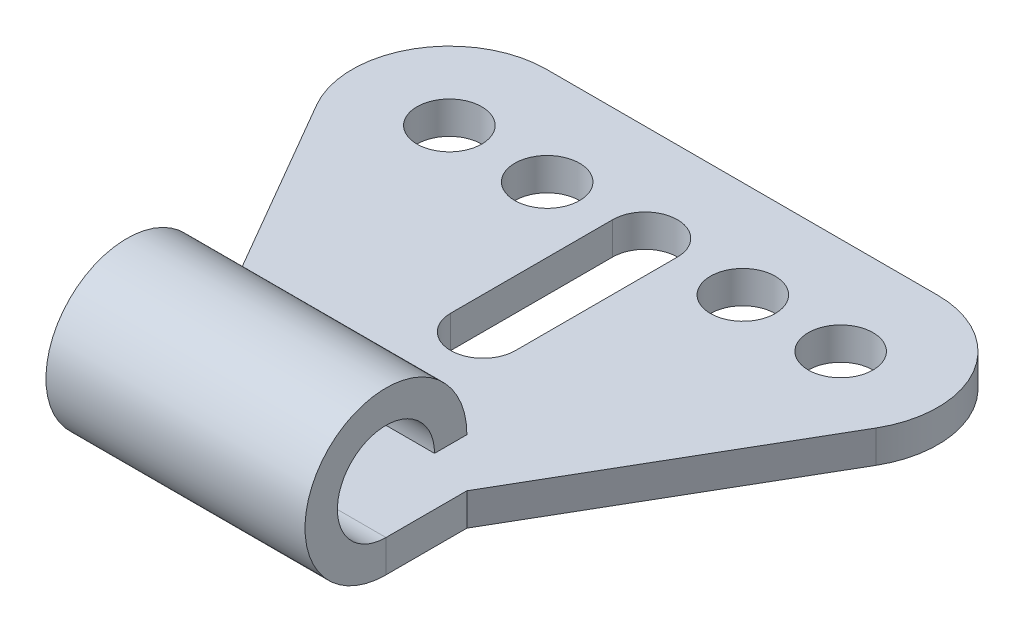
ISO-10303-21;
HEADER;
FILE_DESCRIPTION(('STEP AP214'),'2;1');
FILE_NAME('part.step','',(''),(''),'','','');
FILE_SCHEMA(('AUTOMOTIVE_DESIGN { 1 0 10303 214 1 1 1 1 }'));
ENDSEC;
DATA;
#1=APPLICATION_CONTEXT('core data for automotive mechanical design processes');
#2=APPLICATION_PROTOCOL_DEFINITION('international standard','automotive_design',2000,#1);
#3=PRODUCT_CONTEXT('',#1,'mechanical');
#4=PRODUCT('Part','Part','',(#3));
#5=PRODUCT_RELATED_PRODUCT_CATEGORY('part','',(#4));
#6=PRODUCT_DEFINITION_FORMATION('','',#4);
#7=PRODUCT_DEFINITION_CONTEXT('part definition',#1,'design');
#8=PRODUCT_DEFINITION('design','',#6,#7);
#9=PRODUCT_DEFINITION_SHAPE('','',#8);
#10=(LENGTH_UNIT() NAMED_UNIT(*) SI_UNIT(.MILLI.,.METRE.));
#11=(NAMED_UNIT(*) PLANE_ANGLE_UNIT() SI_UNIT($,.RADIAN.));
#12=(NAMED_UNIT(*) SI_UNIT($,.STERADIAN.) SOLID_ANGLE_UNIT());
#13=UNCERTAINTY_MEASURE_WITH_UNIT(LENGTH_MEASURE(1.E-05),#10,'distance_accuracy_value','');
#14=(GEOMETRIC_REPRESENTATION_CONTEXT(3) GLOBAL_UNCERTAINTY_ASSIGNED_CONTEXT((#13)) GLOBAL_UNIT_ASSIGNED_CONTEXT((#10,
#11,#12)) REPRESENTATION_CONTEXT('',''));
#15=CARTESIAN_POINT('',(0.,0.,0.));
#16=DIRECTION('',(0.,0.,1.));
#17=DIRECTION('',(1.,0.,0.));
#18=AXIS2_PLACEMENT_3D('',#15,#16,#17);
#19=CARTESIAN_POINT('',(-12.0838339120232,2.,-19.));
#20=DIRECTION('',(0.,-1.,0.));
#21=DIRECTION('',(0.,0.,-1.));
#22=AXIS2_PLACEMENT_3D('',#19,#20,#21);
#23=PLANE('',#22);
#24=CARTESIAN_POINT('',(-12.0838339120232,2.,-19.));
#25=DIRECTION('',(0.,1.,0.));
#26=DIRECTION('',(0.,0.,1.));
#27=AXIS2_PLACEMENT_3D('',#24,#25,#26);
#28=CIRCLE('',#27,2.);
#29=CARTESIAN_POINT('',(-12.0838339120232,2.,-17.));
#30=VERTEX_POINT('',#29);
#31=EDGE_CURVE('E274',#30,#30,#28,.T.);
#32=ORIENTED_EDGE('',*,*,#31,.F.);
#33=EDGE_LOOP('',(#32));
#34=FACE_BOUND('',#33,.T.);
#35=CARTESIAN_POINT('',(-12.0838339120232,2.,-19.));
#36=DIRECTION('',(0.,1.,0.));
#37=DIRECTION('',(0.,0.,-1.));
#38=AXIS2_PLACEMENT_3D('',#35,#36,#37);
#39=CIRCLE('',#38,6.);
#40=CARTESIAN_POINT('',(-12.0838339120231,2.,-25.));
#41=VERTEX_POINT('',#40);
#42=CARTESIAN_POINT('',(-17.2740210475939,2.,-15.9896914613689));
#43=VERTEX_POINT('',#42);
#44=EDGE_CURVE('E282',#41,#43,#39,.T.);
#45=ORIENTED_EDGE('',*,*,#44,.T.);
#46=DIRECTION('',(0.501718089771846,0.,0.865031189261803));
#47=VECTOR('',#46,1.);
#48=CARTESIAN_POINT('',(-17.2740210475939,2.,-15.9896914613689));
#49=LINE('',#48,#47);
#50=CARTESIAN_POINT('',(-8.,2.,0.));
#51=VERTEX_POINT('',#50);
#52=EDGE_CURVE('E286',#43,#51,#49,.T.);
#53=ORIENTED_EDGE('',*,*,#52,.T.);
#54=DIRECTION('',(0.,0.,1.));
#55=VECTOR('',#54,1.);
#56=CARTESIAN_POINT('',(-8.,2.,0.));
#57=LINE('',#56,#55);
#58=CARTESIAN_POINT('',(-7.99999999999999,2.,5.));
#59=VERTEX_POINT('',#58);
#60=EDGE_CURVE('E290',#51,#59,#57,.T.);
#61=ORIENTED_EDGE('',*,*,#60,.T.);
#62=DIRECTION('',(1.,0.,0.));
#63=VECTOR('',#62,1.);
#64=CARTESIAN_POINT('',(-7.99999999999999,2.,5.));
#65=LINE('',#64,#63);
#66=CARTESIAN_POINT('',(8.,2.,5.));
#67=VERTEX_POINT('',#66);
#68=EDGE_CURVE('E293',#59,#67,#65,.T.);
#69=ORIENTED_EDGE('',*,*,#68,.T.);
#70=DIRECTION('',(0.,0.,-1.));
#71=VECTOR('',#70,1.);
#72=CARTESIAN_POINT('',(8.,2.,5.));
#73=LINE('',#72,#71);
#74=CARTESIAN_POINT('',(8.,2.,0.));
#75=VERTEX_POINT('',#74);
#76=EDGE_CURVE('E296',#67,#75,#73,.T.);
#77=ORIENTED_EDGE('',*,*,#76,.T.);
#78=DIRECTION('',(0.501718089771846,0.,-0.865031189261803));
#79=VECTOR('',#78,1.);
#80=CARTESIAN_POINT('',(17.2740210475939,2.,-15.9896914613689));
#81=LINE('',#80,#79);
#82=CARTESIAN_POINT('',(17.2740210475939,2.,-15.9896914613689));
#83=VERTEX_POINT('',#82);
#84=EDGE_CURVE('E299',#75,#83,#81,.T.);
#85=ORIENTED_EDGE('',*,*,#84,.T.);
#86=CARTESIAN_POINT('',(12.0838339120232,2.,-19.));
#87=DIRECTION('',(0.,1.,0.));
#88=DIRECTION('',(0.,0.,-1.));
#89=AXIS2_PLACEMENT_3D('',#86,#87,#88);
#90=CIRCLE('',#89,6.);
#91=CARTESIAN_POINT('',(12.0838339120231,2.,-25.));
#92=VERTEX_POINT('',#91);
#93=EDGE_CURVE('E302',#83,#92,#90,.T.);
#94=ORIENTED_EDGE('',*,*,#93,.T.);
#95=DIRECTION('',(-1.,0.,0.));
#96=VECTOR('',#95,1.);
#97=CARTESIAN_POINT('',(-12.0838339120231,2.,-25.));
#98=LINE('',#97,#96);
#99=EDGE_CURVE('E305',#92,#41,#98,.T.);
#100=ORIENTED_EDGE('',*,*,#99,.T.);
#101=EDGE_LOOP('',(#45,#53,#61,#69,#77,#85,#94,#100));
#102=FACE_BOUND('',#101,.T.);
#103=CARTESIAN_POINT('',(0.,2.,-19.));
#104=DIRECTION('',(0.,1.,0.));
#105=DIRECTION('',(0.,0.,1.));
#106=AXIS2_PLACEMENT_3D('',#103,#104,#105);
#107=CIRCLE('',#106,2.);
#108=CARTESIAN_POINT('',(2.,2.,-19.));
#109=VERTEX_POINT('',#108);
#110=CARTESIAN_POINT('',(-2.,2.,-19.));
#111=VERTEX_POINT('',#110);
#112=EDGE_CURVE('E236',#109,#111,#107,.T.);
#113=ORIENTED_EDGE('',*,*,#112,.F.);
#114=DIRECTION('',(0.,0.,-1.));
#115=VECTOR('',#114,1.);
#116=CARTESIAN_POINT('',(2.,2.,-19.));
#117=LINE('',#116,#115);
#118=CARTESIAN_POINT('',(2.,2.,-9.));
#119=VERTEX_POINT('',#118);
#120=EDGE_CURVE('E246',#119,#109,#117,.T.);
#121=ORIENTED_EDGE('',*,*,#120,.F.);
#122=CARTESIAN_POINT('',(0.,2.,-9.));
#123=DIRECTION('',(0.,1.,0.));
#124=DIRECTION('',(0.,0.,1.));
#125=AXIS2_PLACEMENT_3D('',#122,#123,#124);
#126=CIRCLE('',#125,2.);
#127=CARTESIAN_POINT('',(-2.,2.,-9.));
#128=VERTEX_POINT('',#127);
#129=EDGE_CURVE('E243',#128,#119,#126,.T.);
#130=ORIENTED_EDGE('',*,*,#129,.F.);
#131=DIRECTION('',(0.,0.,1.));
#132=VECTOR('',#131,1.);
#133=CARTESIAN_POINT('',(-2.,2.,-19.));
#134=LINE('',#133,#132);
#135=EDGE_CURVE('E239',#111,#128,#134,.T.);
#136=ORIENTED_EDGE('',*,*,#135,.F.);
#137=EDGE_LOOP('',(#113,#121,#130,#136));
#138=FACE_BOUND('',#137,.T.);
#139=CARTESIAN_POINT('',(-6.04191695601158,2.,-19.));
#140=DIRECTION('',(0.,1.,0.));
#141=DIRECTION('',(0.,0.,1.));
#142=AXIS2_PLACEMENT_3D('',#139,#140,#141);
#143=CIRCLE('',#142,2.);
#144=CARTESIAN_POINT('',(-6.04191695601158,2.,-17.));
#145=VERTEX_POINT('',#144);
#146=EDGE_CURVE('E229',#145,#145,#143,.T.);
#147=ORIENTED_EDGE('',*,*,#146,.F.);
#148=EDGE_LOOP('',(#147));
#149=FACE_BOUND('',#148,.T.);
#150=CARTESIAN_POINT('',(6.04191695601158,2.,-19.));
#151=DIRECTION('',(0.,1.,0.));
#152=DIRECTION('',(0.,0.,1.));
#153=AXIS2_PLACEMENT_3D('',#150,#151,#152);
#154=CIRCLE('',#153,2.);
#155=CARTESIAN_POINT('',(6.04191695601158,2.,-17.));
#156=VERTEX_POINT('',#155);
#157=EDGE_CURVE('E221',#156,#156,#154,.T.);
#158=ORIENTED_EDGE('',*,*,#157,.F.);
#159=EDGE_LOOP('',(#158));
#160=FACE_BOUND('',#159,.T.);
#161=CARTESIAN_POINT('',(12.0838339120232,2.,-19.));
#162=DIRECTION('',(0.,1.,0.));
#163=DIRECTION('',(0.,0.,1.));
#164=AXIS2_PLACEMENT_3D('',#161,#162,#163);
#165=CIRCLE('',#164,2.);
#166=CARTESIAN_POINT('',(12.0838339120232,2.,-17.));
#167=VERTEX_POINT('',#166);
#168=EDGE_CURVE('E213',#167,#167,#165,.T.);
#169=ORIENTED_EDGE('',*,*,#168,.F.);
#170=EDGE_LOOP('',(#169));
#171=FACE_BOUND('',#170,.T.);
#172=ADVANCED_FACE('F43',(#34,#102,#138,#149,#160,#171),#23,.F.);
#173=CARTESIAN_POINT('',(-12.0838339120232,0.,-19.));
#174=DIRECTION('',(0.,-1.,0.));
#175=DIRECTION('',(0.,0.,-1.));
#176=AXIS2_PLACEMENT_3D('',#173,#174,#175);
#177=PLANE('',#176);
#178=CARTESIAN_POINT('',(6.04191695601158,0.,-19.));
#179=DIRECTION('',(0.,1.,0.));
#180=DIRECTION('',(0.,0.,1.));
#181=AXIS2_PLACEMENT_3D('',#178,#179,#180);
#182=CIRCLE('',#181,2.);
#183=CARTESIAN_POINT('',(6.04191695601158,0.,-17.));
#184=VERTEX_POINT('',#183);
#185=EDGE_CURVE('E217',#184,#184,#182,.T.);
#186=ORIENTED_EDGE('',*,*,#185,.T.);
#187=EDGE_LOOP('',(#186));
#188=FACE_BOUND('',#187,.T.);
#189=DIRECTION('',(0.,0.,-1.));
#190=VECTOR('',#189,1.);
#191=CARTESIAN_POINT('',(2.,0.,-19.));
#192=LINE('',#191,#190);
#193=CARTESIAN_POINT('',(2.,0.,-9.));
#194=VERTEX_POINT('',#193);
#195=CARTESIAN_POINT('',(2.,0.,-19.));
#196=VERTEX_POINT('',#195);
#197=EDGE_CURVE('E240',#194,#196,#192,.T.);
#198=ORIENTED_EDGE('',*,*,#197,.T.);
#199=CARTESIAN_POINT('',(0.,0.,-19.));
#200=DIRECTION('',(0.,1.,0.));
#201=DIRECTION('',(0.,0.,1.));
#202=AXIS2_PLACEMENT_3D('',#199,#200,#201);
#203=CIRCLE('',#202,2.);
#204=CARTESIAN_POINT('',(-2.,0.,-19.));
#205=VERTEX_POINT('',#204);
#206=EDGE_CURVE('E67',#196,#205,#203,.T.);
#207=ORIENTED_EDGE('',*,*,#206,.T.);
#208=DIRECTION('',(0.,0.,1.));
#209=VECTOR('',#208,1.);
#210=CARTESIAN_POINT('',(-2.,0.,-19.));
#211=LINE('',#210,#209);
#212=CARTESIAN_POINT('',(-2.,0.,-9.));
#213=VERTEX_POINT('',#212);
#214=EDGE_CURVE('E252',#205,#213,#211,.T.);
#215=ORIENTED_EDGE('',*,*,#214,.T.);
#216=CARTESIAN_POINT('',(0.,0.,-9.));
#217=DIRECTION('',(0.,1.,0.));
#218=DIRECTION('',(0.,0.,1.));
#219=AXIS2_PLACEMENT_3D('',#216,#217,#218);
#220=CIRCLE('',#219,2.);
#221=EDGE_CURVE('E256',#213,#194,#220,.T.);
#222=ORIENTED_EDGE('',*,*,#221,.T.);
#223=EDGE_LOOP('',(#198,#207,#215,#222));
#224=FACE_BOUND('',#223,.T.);
#225=CARTESIAN_POINT('',(-12.0838339120232,0.,-19.));
#226=DIRECTION('',(0.,1.,0.));
#227=DIRECTION('',(0.,0.,1.));
#228=AXIS2_PLACEMENT_3D('',#225,#226,#227);
#229=CIRCLE('',#228,2.);
#230=CARTESIAN_POINT('',(-12.0838339120232,0.,-17.));
#231=VERTEX_POINT('',#230);
#232=EDGE_CURVE('E273',#231,#231,#229,.T.);
#233=ORIENTED_EDGE('',*,*,#232,.T.);
#234=EDGE_LOOP('',(#233));
#235=FACE_BOUND('',#234,.T.);
#236=CARTESIAN_POINT('',(-12.0838339120232,0.,-19.));
#237=DIRECTION('',(0.,1.,0.));
#238=DIRECTION('',(0.,0.,-1.));
#239=AXIS2_PLACEMENT_3D('',#236,#237,#238);
#240=CIRCLE('',#239,6.);
#241=CARTESIAN_POINT('',(-12.0838339120231,0.,-25.));
#242=VERTEX_POINT('',#241);
#243=CARTESIAN_POINT('',(-17.2740210475939,0.,-15.9896914613689));
#244=VERTEX_POINT('',#243);
#245=EDGE_CURVE('E278',#242,#244,#240,.T.);
#246=ORIENTED_EDGE('',*,*,#245,.F.);
#247=DIRECTION('',(-1.,0.,0.));
#248=VECTOR('',#247,1.);
#249=CARTESIAN_POINT('',(-12.0838339120231,0.,-25.));
#250=LINE('',#249,#248);
#251=CARTESIAN_POINT('',(12.0838339120231,0.,-25.));
#252=VERTEX_POINT('',#251);
#253=EDGE_CURVE('E287',#252,#242,#250,.T.);
#254=ORIENTED_EDGE('',*,*,#253,.F.);
#255=CARTESIAN_POINT('',(12.0838339120232,0.,-19.));
#256=DIRECTION('',(0.,1.,0.));
#257=DIRECTION('',(0.,0.,-1.));
#258=AXIS2_PLACEMENT_3D('',#255,#256,#257);
#259=CIRCLE('',#258,6.);
#260=CARTESIAN_POINT('',(17.2740210475939,0.,-15.9896914613689));
#261=VERTEX_POINT('',#260);
#262=EDGE_CURVE('E319',#261,#252,#259,.T.);
#263=ORIENTED_EDGE('',*,*,#262,.F.);
#264=DIRECTION('',(0.501718089771846,0.,-0.865031189261803));
#265=VECTOR('',#264,1.);
#266=CARTESIAN_POINT('',(17.2740210475939,0.,-15.9896914613689));
#267=LINE('',#266,#265);
#268=CARTESIAN_POINT('',(8.,0.,0.));
#269=VERTEX_POINT('',#268);
#270=EDGE_CURVE('E316',#269,#261,#267,.T.);
#271=ORIENTED_EDGE('',*,*,#270,.F.);
#272=DIRECTION('',(0.,0.,-1.));
#273=VECTOR('',#272,1.);
#274=CARTESIAN_POINT('',(8.,0.,5.));
#275=LINE('',#274,#273);
#276=CARTESIAN_POINT('',(8.,0.,5.));
#277=VERTEX_POINT('',#276);
#278=EDGE_CURVE('E155',#277,#269,#275,.T.);
#279=ORIENTED_EDGE('',*,*,#278,.F.);
#280=DIRECTION('',(1.,0.,0.));
#281=VECTOR('',#280,1.);
#282=CARTESIAN_POINT('',(-7.99999999999999,0.,5.));
#283=LINE('',#282,#281);
#284=CARTESIAN_POINT('',(-7.99999999999999,0.,5.));
#285=VERTEX_POINT('',#284);
#286=EDGE_CURVE('E148',#285,#277,#283,.T.);
#287=ORIENTED_EDGE('',*,*,#286,.F.);
#288=DIRECTION('',(0.,0.,1.));
#289=VECTOR('',#288,1.);
#290=CARTESIAN_POINT('',(-8.,0.,0.));
#291=LINE('',#290,#289);
#292=CARTESIAN_POINT('',(-8.,0.,0.));
#293=VERTEX_POINT('',#292);
#294=EDGE_CURVE('E153',#293,#285,#291,.T.);
#295=ORIENTED_EDGE('',*,*,#294,.F.);
#296=DIRECTION('',(0.501718089771846,0.,0.865031189261803));
#297=VECTOR('',#296,1.);
#298=CARTESIAN_POINT('',(-17.2740210475939,0.,-15.9896914613689));
#299=LINE('',#298,#297);
#300=EDGE_CURVE('E172',#244,#293,#299,.T.);
#301=ORIENTED_EDGE('',*,*,#300,.F.);
#302=EDGE_LOOP('',(#246,#254,#263,#271,#279,#287,#295,#301));
#303=FACE_BOUND('',#302,.T.);
#304=CARTESIAN_POINT('',(-6.04191695601158,0.,-19.));
#305=DIRECTION('',(0.,1.,0.));
#306=DIRECTION('',(0.,0.,1.));
#307=AXIS2_PLACEMENT_3D('',#304,#305,#306);
#308=CIRCLE('',#307,2.);
#309=CARTESIAN_POINT('',(-6.04191695601158,0.,-17.));
#310=VERTEX_POINT('',#309);
#311=EDGE_CURVE('E225',#310,#310,#308,.T.);
#312=ORIENTED_EDGE('',*,*,#311,.T.);
#313=EDGE_LOOP('',(#312));
#314=FACE_BOUND('',#313,.T.);
#315=CARTESIAN_POINT('',(12.0838339120232,0.,-19.));
#316=DIRECTION('',(0.,1.,0.));
#317=DIRECTION('',(0.,0.,1.));
#318=AXIS2_PLACEMENT_3D('',#315,#316,#317);
#319=CIRCLE('',#318,2.);
#320=CARTESIAN_POINT('',(12.0838339120232,0.,-17.));
#321=VERTEX_POINT('',#320);
#322=EDGE_CURVE('E212',#321,#321,#319,.T.);
#323=ORIENTED_EDGE('',*,*,#322,.T.);
#324=EDGE_LOOP('',(#323));
#325=FACE_BOUND('',#324,.T.);
#326=ADVANCED_FACE('F151',(#188,#224,#235,#303,#314,#325),#177,.T.);
#327=CARTESIAN_POINT('',(-12.0838339120232,2.,-19.));
#328=DIRECTION('',(0.,-1.,0.));
#329=DIRECTION('',(0.,0.,-1.));
#330=AXIS2_PLACEMENT_3D('',#327,#328,#329);
#331=CYLINDRICAL_SURFACE('',#330,6.);
#332=ORIENTED_EDGE('',*,*,#245,.T.);
#333=DIRECTION('',(0.,-1.,0.));
#334=VECTOR('',#333,1.);
#335=CARTESIAN_POINT('',(-17.2740210475939,2.,-15.9896914613689));
#336=LINE('',#335,#334);
#337=EDGE_CURVE('E11',#43,#244,#336,.T.);
#338=ORIENTED_EDGE('',*,*,#337,.F.);
#339=ORIENTED_EDGE('',*,*,#44,.F.);
#340=DIRECTION('',(0.,-1.,0.));
#341=VECTOR('',#340,1.);
#342=CARTESIAN_POINT('',(-12.0838339120231,2.,-25.));
#343=LINE('',#342,#341);
#344=EDGE_CURVE('E308',#41,#242,#343,.T.);
#345=ORIENTED_EDGE('',*,*,#344,.T.);
#346=EDGE_LOOP('',(#332,#338,#339,#345));
#347=FACE_BOUND('',#346,.T.);
#348=ADVANCED_FACE('F45',(#347),#331,.T.);
#349=CARTESIAN_POINT('',(-17.2740210475939,2.,-15.9896914613689));
#350=DIRECTION('',(0.865031189261803,0.,-0.501718089771846));
#351=DIRECTION('',(-0.501718089771846,0.,-0.865031189261803));
#352=AXIS2_PLACEMENT_3D('',#349,#350,#351);
#353=PLANE('',#352);
#354=ORIENTED_EDGE('',*,*,#300,.T.);
#355=DIRECTION('',(0.,-1.,0.));
#356=VECTOR('',#355,1.);
#357=CARTESIAN_POINT('',(-8.,2.,0.));
#358=LINE('',#357,#356);
#359=EDGE_CURVE('E52',#51,#293,#358,.T.);
#360=ORIENTED_EDGE('',*,*,#359,.F.);
#361=ORIENTED_EDGE('',*,*,#52,.F.);
#362=ORIENTED_EDGE('',*,*,#337,.T.);
#363=EDGE_LOOP('',(#354,#360,#361,#362));
#364=FACE_BOUND('',#363,.T.);
#365=ADVANCED_FACE('F395',(#364),#353,.F.);
#366=CARTESIAN_POINT('',(-8.,2.,0.));
#367=DIRECTION('',(1.,0.,0.));
#368=DIRECTION('',(0.,0.,-1.));
#369=AXIS2_PLACEMENT_3D('',#366,#367,#368);
#370=PLANE('',#369);
#371=ORIENTED_EDGE('',*,*,#294,.T.);
#372=DIRECTION('',(0.,-1.,0.));
#373=VECTOR('',#372,1.);
#374=CARTESIAN_POINT('',(-7.99999999999999,2.,5.));
#375=LINE('',#374,#373);
#376=EDGE_CURVE('E168',#59,#285,#375,.T.);
#377=ORIENTED_EDGE('',*,*,#376,.F.);
#378=ORIENTED_EDGE('',*,*,#60,.F.);
#379=ORIENTED_EDGE('',*,*,#359,.T.);
#380=EDGE_LOOP('',(#371,#377,#378,#379));
#381=FACE_BOUND('',#380,.T.);
#382=ADVANCED_FACE('F166',(#381),#370,.F.);
#383=CARTESIAN_POINT('',(8.,2.,5.));
#384=DIRECTION('',(-1.,0.,0.));
#385=DIRECTION('',(0.,0.,1.));
#386=AXIS2_PLACEMENT_3D('',#383,#384,#385);
#387=PLANE('',#386);
#388=ORIENTED_EDGE('',*,*,#278,.T.);
#389=DIRECTION('',(0.,-1.,0.));
#390=VECTOR('',#389,1.);
#391=CARTESIAN_POINT('',(8.,2.,0.));
#392=LINE('',#391,#390);
#393=EDGE_CURVE('E335',#75,#269,#392,.T.);
#394=ORIENTED_EDGE('',*,*,#393,.F.);
#395=ORIENTED_EDGE('',*,*,#76,.F.);
#396=DIRECTION('',(0.,-1.,0.));
#397=VECTOR('',#396,1.);
#398=CARTESIAN_POINT('',(8.,2.,5.));
#399=LINE('',#398,#397);
#400=EDGE_CURVE('E182',#67,#277,#399,.T.);
#401=ORIENTED_EDGE('',*,*,#400,.T.);
#402=EDGE_LOOP('',(#388,#394,#395,#401));
#403=FACE_BOUND('',#402,.T.);
#404=ADVANCED_FACE('F344',(#403),#387,.F.);
#405=CARTESIAN_POINT('',(17.2740210475939,2.,-15.9896914613689));
#406=DIRECTION('',(-0.865031189261803,0.,-0.501718089771846));
#407=DIRECTION('',(-0.501718089771846,0.,0.865031189261803));
#408=AXIS2_PLACEMENT_3D('',#405,#406,#407);
#409=PLANE('',#408);
#410=ORIENTED_EDGE('',*,*,#270,.T.);
#411=DIRECTION('',(0.,-1.,0.));
#412=VECTOR('',#411,1.);
#413=CARTESIAN_POINT('',(17.2740210475939,2.,-15.9896914613689));
#414=LINE('',#413,#412);
#415=EDGE_CURVE('E331',#83,#261,#414,.T.);
#416=ORIENTED_EDGE('',*,*,#415,.F.);
#417=ORIENTED_EDGE('',*,*,#84,.F.);
#418=ORIENTED_EDGE('',*,*,#393,.T.);
#419=EDGE_LOOP('',(#410,#416,#417,#418));
#420=FACE_BOUND('',#419,.T.);
#421=ADVANCED_FACE('F387',(#420),#409,.F.);
#422=CARTESIAN_POINT('',(12.0838339120232,2.,-19.));
#423=DIRECTION('',(0.,-1.,0.));
#424=DIRECTION('',(0.,0.,-1.));
#425=AXIS2_PLACEMENT_3D('',#422,#423,#424);
#426=CYLINDRICAL_SURFACE('',#425,6.);
#427=ORIENTED_EDGE('',*,*,#262,.T.);
#428=DIRECTION('',(0.,-1.,0.));
#429=VECTOR('',#428,1.);
#430=CARTESIAN_POINT('',(12.0838339120231,2.,-25.));
#431=LINE('',#430,#429);
#432=EDGE_CURVE('E327',#92,#252,#431,.T.);
#433=ORIENTED_EDGE('',*,*,#432,.F.);
#434=ORIENTED_EDGE('',*,*,#93,.F.);
#435=ORIENTED_EDGE('',*,*,#415,.T.);
#436=EDGE_LOOP('',(#427,#433,#434,#435));
#437=FACE_BOUND('',#436,.T.);
#438=ADVANCED_FACE('F383',(#437),#426,.T.);
#439=CARTESIAN_POINT('',(-12.0838339120231,2.,-25.));
#440=DIRECTION('',(0.,0.,1.));
#441=DIRECTION('',(1.,0.,0.));
#442=AXIS2_PLACEMENT_3D('',#439,#440,#441);
#443=PLANE('',#442);
#444=ORIENTED_EDGE('',*,*,#253,.T.);
#445=ORIENTED_EDGE('',*,*,#344,.F.);
#446=ORIENTED_EDGE('',*,*,#99,.F.);
#447=ORIENTED_EDGE('',*,*,#432,.T.);
#448=EDGE_LOOP('',(#444,#445,#446,#447));
#449=FACE_BOUND('',#448,.T.);
#450=ADVANCED_FACE('F380',(#449),#443,.F.);
#451=CARTESIAN_POINT('',(-12.0838339120232,2.,-19.));
#452=DIRECTION('',(0.,-1.,0.));
#453=DIRECTION('',(0.,0.,-1.));
#454=AXIS2_PLACEMENT_3D('',#451,#452,#453);
#455=CYLINDRICAL_SURFACE('',#454,2.);
#456=ORIENTED_EDGE('',*,*,#31,.T.);
#457=EDGE_LOOP('',(#456));
#458=FACE_BOUND('',#457,.T.);
#459=ORIENTED_EDGE('',*,*,#232,.F.);
#460=EDGE_LOOP('',(#459));
#461=FACE_BOUND('',#460,.T.);
#462=ADVANCED_FACE('F377',(#458,#461),#455,.F.);
#463=CARTESIAN_POINT('',(0.,2.,-19.));
#464=DIRECTION('',(0.,-1.,0.));
#465=DIRECTION('',(0.,0.,-1.));
#466=AXIS2_PLACEMENT_3D('',#463,#464,#465);
#467=CYLINDRICAL_SURFACE('',#466,2.);
#468=ORIENTED_EDGE('',*,*,#206,.F.);
#469=DIRECTION('',(0.,-1.,0.));
#470=VECTOR('',#469,1.);
#471=CARTESIAN_POINT('',(2.,2.,-19.));
#472=LINE('',#471,#470);
#473=EDGE_CURVE('E249',#109,#196,#472,.T.);
#474=ORIENTED_EDGE('',*,*,#473,.F.);
#475=ORIENTED_EDGE('',*,*,#112,.T.);
#476=DIRECTION('',(0.,-1.,0.));
#477=VECTOR('',#476,1.);
#478=CARTESIAN_POINT('',(-2.,2.,-19.));
#479=LINE('',#478,#477);
#480=EDGE_CURVE('E270',#111,#205,#479,.T.);
#481=ORIENTED_EDGE('',*,*,#480,.T.);
#482=EDGE_LOOP('',(#468,#474,#475,#481));
#483=FACE_BOUND('',#482,.T.);
#484=ADVANCED_FACE('F436',(#483),#467,.F.);
#485=CARTESIAN_POINT('',(-2.,2.,-19.));
#486=DIRECTION('',(1.,0.,0.));
#487=DIRECTION('',(0.,0.,-1.));
#488=AXIS2_PLACEMENT_3D('',#485,#486,#487);
#489=PLANE('',#488);
#490=ORIENTED_EDGE('',*,*,#214,.F.);
#491=ORIENTED_EDGE('',*,*,#480,.F.);
#492=ORIENTED_EDGE('',*,*,#135,.T.);
#493=DIRECTION('',(0.,-1.,0.));
#494=VECTOR('',#493,1.);
#495=CARTESIAN_POINT('',(-2.,2.,-9.));
#496=LINE('',#495,#494);
#497=EDGE_CURVE('E267',#128,#213,#496,.T.);
#498=ORIENTED_EDGE('',*,*,#497,.T.);
#499=EDGE_LOOP('',(#490,#491,#492,#498));
#500=FACE_BOUND('',#499,.T.);
#501=ADVANCED_FACE('F441',(#500),#489,.T.);
#502=CARTESIAN_POINT('',(0.,2.,-9.));
#503=DIRECTION('',(0.,-1.,0.));
#504=DIRECTION('',(0.,0.,-1.));
#505=AXIS2_PLACEMENT_3D('',#502,#503,#504);
#506=CYLINDRICAL_SURFACE('',#505,2.);
#507=ORIENTED_EDGE('',*,*,#221,.F.);
#508=ORIENTED_EDGE('',*,*,#497,.F.);
#509=ORIENTED_EDGE('',*,*,#129,.T.);
#510=DIRECTION('',(0.,-1.,0.));
#511=VECTOR('',#510,1.);
#512=CARTESIAN_POINT('',(2.,2.,-9.));
#513=LINE('',#512,#511);
#514=EDGE_CURVE('E59',#119,#194,#513,.T.);
#515=ORIENTED_EDGE('',*,*,#514,.T.);
#516=EDGE_LOOP('',(#507,#508,#509,#515));
#517=FACE_BOUND('',#516,.T.);
#518=ADVANCED_FACE('F445',(#517),#506,.F.);
#519=CARTESIAN_POINT('',(2.,2.,-19.));
#520=DIRECTION('',(-1.,0.,0.));
#521=DIRECTION('',(0.,0.,1.));
#522=AXIS2_PLACEMENT_3D('',#519,#520,#521);
#523=PLANE('',#522);
#524=ORIENTED_EDGE('',*,*,#197,.F.);
#525=ORIENTED_EDGE('',*,*,#514,.F.);
#526=ORIENTED_EDGE('',*,*,#120,.T.);
#527=ORIENTED_EDGE('',*,*,#473,.T.);
#528=EDGE_LOOP('',(#524,#525,#526,#527));
#529=FACE_BOUND('',#528,.T.);
#530=ADVANCED_FACE('F451',(#529),#523,.T.);
#531=CARTESIAN_POINT('',(-6.04191695601158,2.,-19.));
#532=DIRECTION('',(0.,-1.,0.));
#533=DIRECTION('',(0.,0.,-1.));
#534=AXIS2_PLACEMENT_3D('',#531,#532,#533);
#535=CYLINDRICAL_SURFACE('',#534,2.);
#536=ORIENTED_EDGE('',*,*,#146,.T.);
#537=EDGE_LOOP('',(#536));
#538=FACE_BOUND('',#537,.T.);
#539=ORIENTED_EDGE('',*,*,#311,.F.);
#540=EDGE_LOOP('',(#539));
#541=FACE_BOUND('',#540,.T.);
#542=ADVANCED_FACE('F428',(#538,#541),#535,.F.);
#543=CARTESIAN_POINT('',(6.04191695601158,2.,-19.));
#544=DIRECTION('',(0.,-1.,0.));
#545=DIRECTION('',(0.,0.,-1.));
#546=AXIS2_PLACEMENT_3D('',#543,#544,#545);
#547=CYLINDRICAL_SURFACE('',#546,2.);
#548=ORIENTED_EDGE('',*,*,#157,.T.);
#549=EDGE_LOOP('',(#548));
#550=FACE_BOUND('',#549,.T.);
#551=ORIENTED_EDGE('',*,*,#185,.F.);
#552=EDGE_LOOP('',(#551));
#553=FACE_BOUND('',#552,.T.);
#554=ADVANCED_FACE('F362',(#550,#553),#547,.F.);
#555=CARTESIAN_POINT('',(12.0838339120232,2.,-19.));
#556=DIRECTION('',(0.,-1.,0.));
#557=DIRECTION('',(0.,0.,-1.));
#558=AXIS2_PLACEMENT_3D('',#555,#556,#557);
#559=CYLINDRICAL_SURFACE('',#558,2.);
#560=ORIENTED_EDGE('',*,*,#168,.T.);
#561=EDGE_LOOP('',(#560));
#562=FACE_BOUND('',#561,.T.);
#563=ORIENTED_EDGE('',*,*,#322,.F.);
#564=EDGE_LOOP('',(#563));
#565=FACE_BOUND('',#564,.T.);
#566=ADVANCED_FACE('F355',(#562,#565),#559,.F.);
#567=CARTESIAN_POINT('',(0.,4.99999999999997,2.));
#568=DIRECTION('',(0.,1.,0.));
#569=DIRECTION('',(1.,0.,0.));
#570=AXIS2_PLACEMENT_3D('',#567,#568,#569);
#571=PLANE('',#570);
#572=DIRECTION('',(0.,0.,-1.));
#573=VECTOR('',#572,1.);
#574=CARTESIAN_POINT('',(8.,4.99999999999997,2.));
#575=LINE('',#574,#573);
#576=CARTESIAN_POINT('',(8.,4.99999999999997,2.));
#577=VERTEX_POINT('',#576);
#578=CARTESIAN_POINT('',(8.,4.99999999999995,0.));
#579=VERTEX_POINT('',#578);
#580=EDGE_CURVE('E194',#577,#579,#575,.T.);
#581=ORIENTED_EDGE('',*,*,#580,.F.);
#582=DIRECTION('',(1.,0.,0.));
#583=VECTOR('',#582,1.);
#584=CARTESIAN_POINT('',(8.,4.99999999999997,2.));
#585=LINE('',#584,#583);
#586=CARTESIAN_POINT('',(-7.99999999999999,4.99999999999997,2.));
#587=VERTEX_POINT('',#586);
#588=EDGE_CURVE('E206',#587,#577,#585,.T.);
#589=ORIENTED_EDGE('',*,*,#588,.F.);
#590=DIRECTION('',(0.,0.,-1.));
#591=VECTOR('',#590,1.);
#592=CARTESIAN_POINT('',(-7.99999999999999,4.99999999999997,2.));
#593=LINE('',#592,#591);
#594=CARTESIAN_POINT('',(-7.99999999999999,4.99999999999995,0.));
#595=VERTEX_POINT('',#594);
#596=EDGE_CURVE('E189',#587,#595,#593,.T.);
#597=ORIENTED_EDGE('',*,*,#596,.T.);
#598=DIRECTION('',(1.,0.,0.));
#599=VECTOR('',#598,1.);
#600=CARTESIAN_POINT('',(8.,4.99999999999995,0.));
#601=LINE('',#600,#599);
#602=EDGE_CURVE('E187',#595,#579,#601,.T.);
#603=ORIENTED_EDGE('',*,*,#602,.T.);
#604=EDGE_LOOP('',(#581,#589,#597,#603));
#605=FACE_BOUND('',#604,.T.);
#606=ADVANCED_FACE('F353',(#605),#571,.F.);
#607=CARTESIAN_POINT('',(-7.99999999999999,5.,5.));
#608=DIRECTION('',(-1.,0.,0.));
#609=DIRECTION('',(0.,0.,1.));
#610=AXIS2_PLACEMENT_3D('',#607,#608,#609);
#611=PLANE('',#610);
#612=ORIENTED_EDGE('',*,*,#596,.F.);
#613=CARTESIAN_POINT('',(-7.99999999999999,5.,5.));
#614=DIRECTION('',(1.,0.,0.));
#615=DIRECTION('',(0.,0.,-1.));
#616=AXIS2_PLACEMENT_3D('',#613,#614,#615);
#617=CIRCLE('',#616,3.);
#618=EDGE_CURVE('E180',#59,#587,#617,.F.);
#619=ORIENTED_EDGE('',*,*,#618,.F.);
#620=ORIENTED_EDGE('',*,*,#376,.T.);
#621=CARTESIAN_POINT('',(-7.99999999999999,5.,5.));
#622=DIRECTION('',(1.,0.,0.));
#623=DIRECTION('',(0.,0.,-1.));
#624=AXIS2_PLACEMENT_3D('',#621,#622,#623);
#625=CIRCLE('',#624,5.);
#626=EDGE_CURVE('E178',#285,#595,#625,.F.);
#627=ORIENTED_EDGE('',*,*,#626,.T.);
#628=EDGE_LOOP('',(#612,#619,#620,#627));
#629=FACE_BOUND('',#628,.T.);
#630=ADVANCED_FACE('F177',(#629),#611,.T.);
#631=CARTESIAN_POINT('',(8.,5.,5.));
#632=DIRECTION('',(-1.,0.,0.));
#633=DIRECTION('',(0.,0.,1.));
#634=AXIS2_PLACEMENT_3D('',#631,#632,#633);
#635=PLANE('',#634);
#636=CARTESIAN_POINT('',(8.,5.,5.));
#637=DIRECTION('',(1.,0.,0.));
#638=DIRECTION('',(0.,0.,-1.));
#639=AXIS2_PLACEMENT_3D('',#636,#637,#638);
#640=CIRCLE('',#639,3.);
#641=EDGE_CURVE('E202',#577,#67,#640,.T.);
#642=ORIENTED_EDGE('',*,*,#641,.F.);
#643=ORIENTED_EDGE('',*,*,#580,.T.);
#644=CARTESIAN_POINT('',(8.,5.,5.));
#645=DIRECTION('',(1.,0.,0.));
#646=DIRECTION('',(0.,0.,-1.));
#647=AXIS2_PLACEMENT_3D('',#644,#645,#646);
#648=CIRCLE('',#647,5.);
#649=EDGE_CURVE('E190',#579,#277,#648,.T.);
#650=ORIENTED_EDGE('',*,*,#649,.T.);
#651=ORIENTED_EDGE('',*,*,#400,.F.);
#652=EDGE_LOOP('',(#642,#643,#650,#651));
#653=FACE_BOUND('',#652,.T.);
#654=ADVANCED_FACE('F348',(#653),#635,.F.);
#655=CARTESIAN_POINT('',(8.,5.,5.));
#656=DIRECTION('',(1.,0.,0.));
#657=DIRECTION('',(0.,0.,-1.));
#658=AXIS2_PLACEMENT_3D('',#655,#656,#657);
#659=CYLINDRICAL_SURFACE('',#658,5.);
#660=ORIENTED_EDGE('',*,*,#286,.T.);
#661=ORIENTED_EDGE('',*,*,#649,.F.);
#662=ORIENTED_EDGE('',*,*,#602,.F.);
#663=ORIENTED_EDGE('',*,*,#626,.F.);
#664=EDGE_LOOP('',(#660,#661,#662,#663));
#665=FACE_BOUND('',#664,.T.);
#666=ADVANCED_FACE('F185',(#665),#659,.T.);
#667=CARTESIAN_POINT('',(8.,5.,5.));
#668=DIRECTION('',(1.,0.,0.));
#669=DIRECTION('',(0.,0.,-1.));
#670=AXIS2_PLACEMENT_3D('',#667,#668,#669);
#671=CYLINDRICAL_SURFACE('',#670,3.);
#672=ORIENTED_EDGE('',*,*,#68,.F.);
#673=ORIENTED_EDGE('',*,*,#618,.T.);
#674=ORIENTED_EDGE('',*,*,#588,.T.);
#675=ORIENTED_EDGE('',*,*,#641,.T.);
#676=EDGE_LOOP('',(#672,#673,#674,#675));
#677=FACE_BOUND('',#676,.T.);
#678=ADVANCED_FACE('F350',(#677),#671,.F.);
#679=CLOSED_SHELL('',(#172,#326,#348,#365,#382,#404,#421,#438,#450,#462,#484,#501,#518,#530,
#542,#554,#566,#606,#630,#654,#666,#678));
#680=MANIFOLD_SOLID_BREP('B2',#679);
#681=ADVANCED_BREP_SHAPE_REPRESENTATION('',(#18,#680),#14);
#682=SHAPE_DEFINITION_REPRESENTATION(#9,#681);
ENDSEC;
END-ISO-10303-21;
